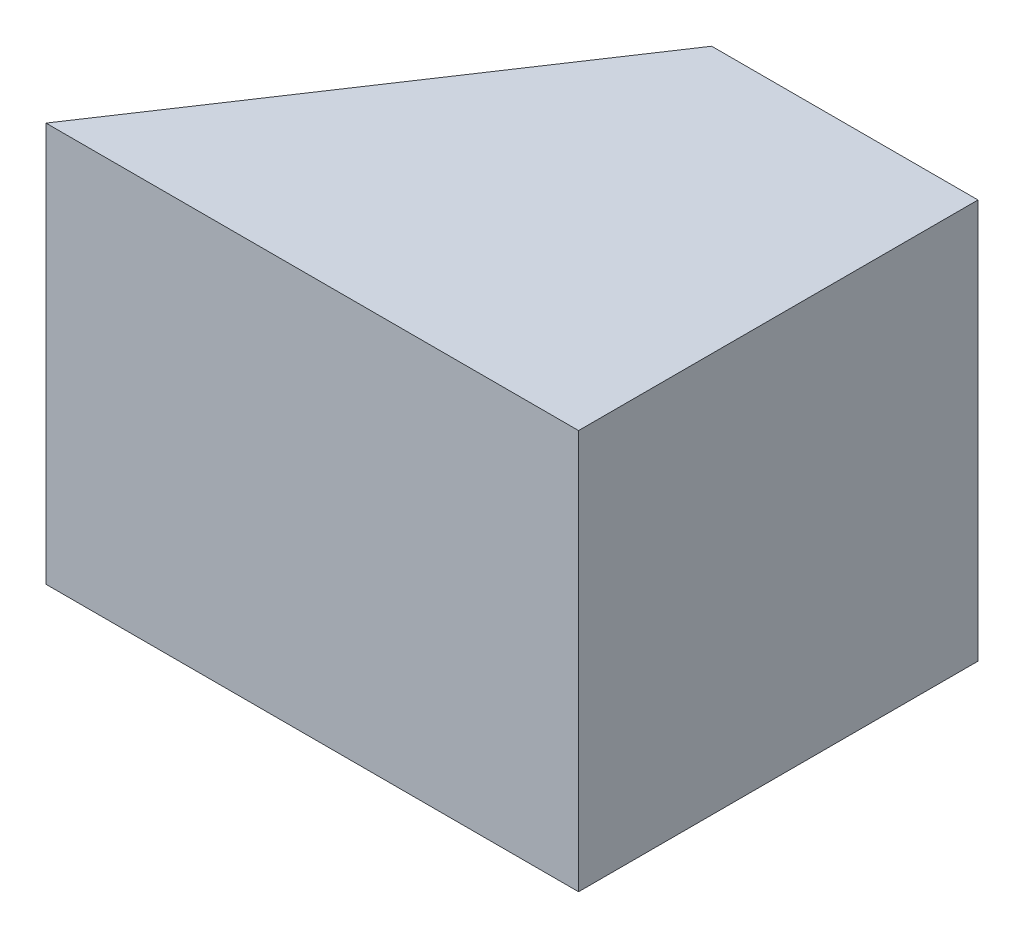
ISO-10303-21;
HEADER;
FILE_DESCRIPTION(('STEP AP214'),'2;1');
FILE_NAME('part.step','',(''),(''),'','','');
FILE_SCHEMA(('AUTOMOTIVE_DESIGN { 1 0 10303 214 1 1 1 1 }'));
ENDSEC;
DATA;
#1=APPLICATION_CONTEXT('core data for automotive mechanical design processes');
#2=APPLICATION_PROTOCOL_DEFINITION('international standard','automotive_design',2000,#1);
#3=PRODUCT_CONTEXT('',#1,'mechanical');
#4=PRODUCT('Part','Part','',(#3));
#5=PRODUCT_RELATED_PRODUCT_CATEGORY('part','',(#4));
#6=PRODUCT_DEFINITION_FORMATION('','',#4);
#7=PRODUCT_DEFINITION_CONTEXT('part definition',#1,'design');
#8=PRODUCT_DEFINITION('design','',#6,#7);
#9=PRODUCT_DEFINITION_SHAPE('','',#8);
#10=(LENGTH_UNIT() NAMED_UNIT(*) SI_UNIT(.MILLI.,.METRE.));
#11=(NAMED_UNIT(*) PLANE_ANGLE_UNIT() SI_UNIT($,.RADIAN.));
#12=(NAMED_UNIT(*) SI_UNIT($,.STERADIAN.) SOLID_ANGLE_UNIT());
#13=UNCERTAINTY_MEASURE_WITH_UNIT(LENGTH_MEASURE(1.E-05),#10,'distance_accuracy_value','');
#14=(GEOMETRIC_REPRESENTATION_CONTEXT(3) GLOBAL_UNCERTAINTY_ASSIGNED_CONTEXT((#13)) GLOBAL_UNIT_ASSIGNED_CONTEXT((#10,
#11,#12)) REPRESENTATION_CONTEXT('',''));
#15=CARTESIAN_POINT('',(0.,0.,0.));
#16=DIRECTION('',(0.,0.,1.));
#17=DIRECTION('',(1.,0.,0.));
#18=AXIS2_PLACEMENT_3D('',#15,#16,#17);
#19=CARTESIAN_POINT('',(50.8,-38.1,38.1));
#20=DIRECTION('',(-1.,0.,0.));
#21=DIRECTION('',(0.,0.,1.));
#22=AXIS2_PLACEMENT_3D('',#19,#20,#21);
#23=PLANE('',#22);
#24=DIRECTION('',(0.,1.,0.));
#25=VECTOR('',#24,1.);
#26=CARTESIAN_POINT('',(50.8,-38.1,-38.1));
#27=LINE('',#26,#25);
#28=CARTESIAN_POINT('',(50.8,-38.1,-38.1));
#29=VERTEX_POINT('',#28);
#30=CARTESIAN_POINT('',(50.8,38.1,-38.1));
#31=VERTEX_POINT('',#30);
#32=EDGE_CURVE('E94',#29,#31,#27,.T.);
#33=ORIENTED_EDGE('',*,*,#32,.T.);
#34=DIRECTION('',(0.,0.,-1.));
#35=VECTOR('',#34,1.);
#36=CARTESIAN_POINT('',(50.8,38.1,38.1));
#37=LINE('',#36,#35);
#38=CARTESIAN_POINT('',(50.8,38.1,38.1));
#39=VERTEX_POINT('',#38);
#40=EDGE_CURVE('E11',#39,#31,#37,.T.);
#41=ORIENTED_EDGE('',*,*,#40,.F.);
#42=DIRECTION('',(0.,1.,0.));
#43=VECTOR('',#42,1.);
#44=CARTESIAN_POINT('',(50.8,-38.1,38.1));
#45=LINE('',#44,#43);
#46=CARTESIAN_POINT('',(50.8,-38.1,38.1));
#47=VERTEX_POINT('',#46);
#48=EDGE_CURVE('E88',#47,#39,#45,.T.);
#49=ORIENTED_EDGE('',*,*,#48,.F.);
#50=DIRECTION('',(0.,0.,-1.));
#51=VECTOR('',#50,1.);
#52=CARTESIAN_POINT('',(50.8,-38.1,38.1));
#53=LINE('',#52,#51);
#54=EDGE_CURVE('E50',#47,#29,#53,.T.);
#55=ORIENTED_EDGE('',*,*,#54,.T.);
#56=EDGE_LOOP('',(#33,#41,#49,#55));
#57=FACE_BOUND('',#56,.T.);
#58=ADVANCED_FACE('F43',(#57),#23,.F.);
#59=CARTESIAN_POINT('',(-50.8,38.1,38.1));
#60=DIRECTION('',(0.,-1.,0.));
#61=DIRECTION('',(0.,0.,-1.));
#62=AXIS2_PLACEMENT_3D('',#59,#60,#61);
#63=PLANE('',#62);
#64=DIRECTION('',(-1.,0.,0.));
#65=VECTOR('',#64,1.);
#66=CARTESIAN_POINT('',(-50.8,38.1,-38.1));
#67=LINE('',#66,#65);
#68=CARTESIAN_POINT('',(0.,38.1,-38.1));
#69=VERTEX_POINT('',#68);
#70=EDGE_CURVE('E89',#31,#69,#67,.T.);
#71=ORIENTED_EDGE('',*,*,#70,.T.);
#72=DIRECTION('',(0.554700196225229,0.,-0.832050294337844));
#73=VECTOR('',#72,1.);
#74=CARTESIAN_POINT('',(-50.8,38.1,38.1));
#75=LINE('',#74,#73);
#76=CARTESIAN_POINT('',(-50.8,38.1,38.1));
#77=VERTEX_POINT('',#76);
#78=EDGE_CURVE('E57',#77,#69,#75,.T.);
#79=ORIENTED_EDGE('',*,*,#78,.F.);
#80=DIRECTION('',(-1.,0.,0.));
#81=VECTOR('',#80,1.);
#82=CARTESIAN_POINT('',(-50.8,38.1,38.1));
#83=LINE('',#82,#81);
#84=EDGE_CURVE('E105',#39,#77,#83,.T.);
#85=ORIENTED_EDGE('',*,*,#84,.F.);
#86=ORIENTED_EDGE('',*,*,#40,.T.);
#87=EDGE_LOOP('',(#71,#79,#85,#86));
#88=FACE_BOUND('',#87,.T.);
#89=ADVANCED_FACE('F113',(#88),#63,.F.);
#90=CARTESIAN_POINT('',(-50.8,-38.1,38.1));
#91=DIRECTION('',(0.,1.,0.));
#92=DIRECTION('',(0.,0.,1.));
#93=AXIS2_PLACEMENT_3D('',#90,#91,#92);
#94=PLANE('',#93);
#95=DIRECTION('',(1.,0.,0.));
#96=VECTOR('',#95,1.);
#97=CARTESIAN_POINT('',(-50.8,-38.1,38.1));
#98=LINE('',#97,#96);
#99=CARTESIAN_POINT('',(-50.8,-38.1,38.1));
#100=VERTEX_POINT('',#99);
#101=EDGE_CURVE('E66',#100,#47,#98,.T.);
#102=ORIENTED_EDGE('',*,*,#101,.F.);
#103=DIRECTION('',(0.554700196225229,0.,-0.832050294337844));
#104=VECTOR('',#103,1.);
#105=CARTESIAN_POINT('',(-50.8,-38.1,38.1));
#106=LINE('',#105,#104);
#107=CARTESIAN_POINT('',(0.,-38.1,-38.1));
#108=VERTEX_POINT('',#107);
#109=EDGE_CURVE('E85',#100,#108,#106,.T.);
#110=ORIENTED_EDGE('',*,*,#109,.T.);
#111=DIRECTION('',(1.,0.,0.));
#112=VECTOR('',#111,1.);
#113=CARTESIAN_POINT('',(-50.8,-38.1,-38.1));
#114=LINE('',#113,#112);
#115=EDGE_CURVE('E80',#108,#29,#114,.T.);
#116=ORIENTED_EDGE('',*,*,#115,.T.);
#117=ORIENTED_EDGE('',*,*,#54,.F.);
#118=EDGE_LOOP('',(#102,#110,#116,#117));
#119=FACE_BOUND('',#118,.T.);
#120=ADVANCED_FACE('F82',(#119),#94,.F.);
#121=CARTESIAN_POINT('',(0.,0.,38.1));
#122=DIRECTION('',(0.,0.,-1.));
#123=DIRECTION('',(-1.,0.,0.));
#124=AXIS2_PLACEMENT_3D('',#121,#122,#123);
#125=PLANE('',#124);
#126=ORIENTED_EDGE('',*,*,#48,.T.);
#127=ORIENTED_EDGE('',*,*,#84,.T.);
#128=DIRECTION('',(0.,-1.,0.));
#129=VECTOR('',#128,1.);
#130=CARTESIAN_POINT('',(-50.8,-38.1,38.1));
#131=LINE('',#130,#129);
#132=EDGE_CURVE('E103',#77,#100,#131,.T.);
#133=ORIENTED_EDGE('',*,*,#132,.T.);
#134=ORIENTED_EDGE('',*,*,#101,.T.);
#135=EDGE_LOOP('',(#126,#127,#133,#134));
#136=FACE_BOUND('',#135,.T.);
#137=ADVANCED_FACE('F110',(#136),#125,.F.);
#138=CARTESIAN_POINT('',(0.,0.,-38.1));
#139=DIRECTION('',(0.,0.,-1.));
#140=DIRECTION('',(-1.,0.,0.));
#141=AXIS2_PLACEMENT_3D('',#138,#139,#140);
#142=PLANE('',#141);
#143=DIRECTION('',(0.,1.,0.));
#144=VECTOR('',#143,1.);
#145=CARTESIAN_POINT('',(0.,-38.1,-38.1));
#146=LINE('',#145,#144);
#147=EDGE_CURVE('E97',#108,#69,#146,.T.);
#148=ORIENTED_EDGE('',*,*,#147,.T.);
#149=ORIENTED_EDGE('',*,*,#70,.F.);
#150=ORIENTED_EDGE('',*,*,#32,.F.);
#151=ORIENTED_EDGE('',*,*,#115,.F.);
#152=EDGE_LOOP('',(#148,#149,#150,#151));
#153=FACE_BOUND('',#152,.T.);
#154=ADVANCED_FACE('F95',(#153),#142,.T.);
#155=CARTESIAN_POINT('',(-50.8,-38.1,38.1));
#156=DIRECTION('',(0.832050294337844,0.,0.554700196225229));
#157=DIRECTION('',(0.554700196225229,0.,-0.832050294337844));
#158=AXIS2_PLACEMENT_3D('',#155,#156,#157);
#159=PLANE('',#158);
#160=ORIENTED_EDGE('',*,*,#78,.T.);
#161=ORIENTED_EDGE('',*,*,#147,.F.);
#162=ORIENTED_EDGE('',*,*,#109,.F.);
#163=ORIENTED_EDGE('',*,*,#132,.F.);
#164=EDGE_LOOP('',(#160,#161,#162,#163));
#165=FACE_BOUND('',#164,.T.);
#166=ADVANCED_FACE('F117',(#165),#159,.F.);
#167=CLOSED_SHELL('',(#58,#89,#120,#137,#154,#166));
#168=MANIFOLD_SOLID_BREP('B2',#167);
#169=ADVANCED_BREP_SHAPE_REPRESENTATION('',(#18,#168),#14);
#170=SHAPE_DEFINITION_REPRESENTATION(#9,#169);
ENDSEC;
END-ISO-10303-21;
